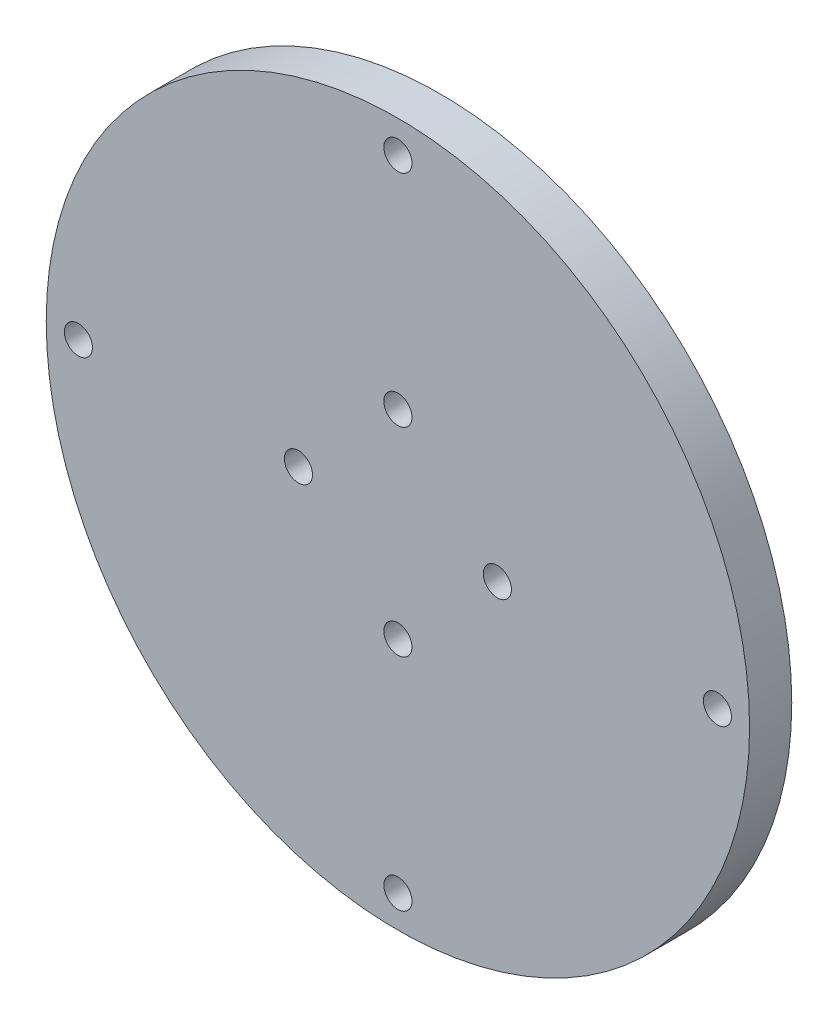
ISO-10303-21;
HEADER;
FILE_DESCRIPTION(('STEP AP214'),'2;1');
FILE_NAME('part.step','',(''),(''),'','','');
FILE_SCHEMA(('AUTOMOTIVE_DESIGN { 1 0 10303 214 1 1 1 1 }'));
ENDSEC;
DATA;
#1=APPLICATION_CONTEXT('core data for automotive mechanical design processes');
#2=APPLICATION_PROTOCOL_DEFINITION('international standard','automotive_design',2000,#1);
#3=PRODUCT_CONTEXT('',#1,'mechanical');
#4=PRODUCT('Part','Part','',(#3));
#5=PRODUCT_RELATED_PRODUCT_CATEGORY('part','',(#4));
#6=PRODUCT_DEFINITION_FORMATION('','',#4);
#7=PRODUCT_DEFINITION_CONTEXT('part definition',#1,'design');
#8=PRODUCT_DEFINITION('design','',#6,#7);
#9=PRODUCT_DEFINITION_SHAPE('','',#8);
#10=(LENGTH_UNIT() NAMED_UNIT(*) SI_UNIT(.MILLI.,.METRE.));
#11=(NAMED_UNIT(*) PLANE_ANGLE_UNIT() SI_UNIT($,.RADIAN.));
#12=(NAMED_UNIT(*) SI_UNIT($,.STERADIAN.) SOLID_ANGLE_UNIT());
#13=UNCERTAINTY_MEASURE_WITH_UNIT(LENGTH_MEASURE(1.E-05),#10,'distance_accuracy_value','');
#14=(GEOMETRIC_REPRESENTATION_CONTEXT(3) GLOBAL_UNCERTAINTY_ASSIGNED_CONTEXT((#13)) GLOBAL_UNIT_ASSIGNED_CONTEXT((#10,
#11,#12)) REPRESENTATION_CONTEXT('',''));
#15=CARTESIAN_POINT('',(0.,0.,0.));
#16=DIRECTION('',(0.,0.,1.));
#17=DIRECTION('',(1.,0.,0.));
#18=AXIS2_PLACEMENT_3D('',#15,#16,#17);
#19=CARTESIAN_POINT('',(0.,7.07106781186546,1.5));
#20=DIRECTION('',(0.,0.,-1.));
#21=DIRECTION('',(-1.,0.,0.));
#22=AXIS2_PLACEMENT_3D('',#19,#20,#21);
#23=CYLINDRICAL_SURFACE('',#22,1.);
#24=CARTESIAN_POINT('',(0.,7.07106781186546,1.5));
#25=DIRECTION('',(0.,0.,1.));
#26=DIRECTION('',(1.,0.,0.));
#27=AXIS2_PLACEMENT_3D('',#24,#25,#26);
#28=CIRCLE('',#27,1.);
#29=CARTESIAN_POINT('',(1.,7.07106781186546,1.5));
#30=VERTEX_POINT('',#29);
#31=EDGE_CURVE('E45',#30,#30,#28,.T.);
#32=ORIENTED_EDGE('',*,*,#31,.T.);
#33=EDGE_LOOP('',(#32));
#34=FACE_BOUND('',#33,.T.);
#35=CARTESIAN_POINT('',(0.,7.07106781186546,-1.5));
#36=DIRECTION('',(0.,0.,1.));
#37=DIRECTION('',(1.,0.,0.));
#38=AXIS2_PLACEMENT_3D('',#35,#36,#37);
#39=CIRCLE('',#38,1.);
#40=CARTESIAN_POINT('',(1.,7.07106781186546,-1.5));
#41=VERTEX_POINT('',#40);
#42=EDGE_CURVE('E74',#41,#41,#39,.T.);
#43=ORIENTED_EDGE('',*,*,#42,.F.);
#44=EDGE_LOOP('',(#43));
#45=FACE_BOUND('',#44,.T.);
#46=ADVANCED_FACE('F37',(#34,#45),#23,.F.);
#47=CARTESIAN_POINT('',(7.07106781186549,0.,1.5));
#48=DIRECTION('',(0.,0.,-1.));
#49=DIRECTION('',(-1.,0.,0.));
#50=AXIS2_PLACEMENT_3D('',#47,#48,#49);
#51=CYLINDRICAL_SURFACE('',#50,1.);
#52=CARTESIAN_POINT('',(7.07106781186549,0.,1.5));
#53=DIRECTION('',(0.,0.,1.));
#54=DIRECTION('',(1.,0.,0.));
#55=AXIS2_PLACEMENT_3D('',#52,#53,#54);
#56=CIRCLE('',#55,1.);
#57=CARTESIAN_POINT('',(8.07106781186549,0.,1.5));
#58=VERTEX_POINT('',#57);
#59=EDGE_CURVE('E50',#58,#58,#56,.T.);
#60=ORIENTED_EDGE('',*,*,#59,.T.);
#61=EDGE_LOOP('',(#60));
#62=FACE_BOUND('',#61,.T.);
#63=CARTESIAN_POINT('',(7.07106781186549,0.,-1.5));
#64=DIRECTION('',(0.,0.,1.));
#65=DIRECTION('',(1.,0.,0.));
#66=AXIS2_PLACEMENT_3D('',#63,#64,#65);
#67=CIRCLE('',#66,1.);
#68=CARTESIAN_POINT('',(8.07106781186549,0.,-1.5));
#69=VERTEX_POINT('',#68);
#70=EDGE_CURVE('E72',#69,#69,#67,.T.);
#71=ORIENTED_EDGE('',*,*,#70,.F.);
#72=EDGE_LOOP('',(#71));
#73=FACE_BOUND('',#72,.T.);
#74=ADVANCED_FACE('F104',(#62,#73),#51,.F.);
#75=CARTESIAN_POINT('',(0.,-7.07106781186547,1.5));
#76=DIRECTION('',(0.,0.,-1.));
#77=DIRECTION('',(-1.,0.,0.));
#78=AXIS2_PLACEMENT_3D('',#75,#76,#77);
#79=CYLINDRICAL_SURFACE('',#78,1.);
#80=CARTESIAN_POINT('',(0.,-7.07106781186547,1.5));
#81=DIRECTION('',(0.,0.,1.));
#82=DIRECTION('',(1.,0.,0.));
#83=AXIS2_PLACEMENT_3D('',#80,#81,#82);
#84=CIRCLE('',#83,1.);
#85=CARTESIAN_POINT('',(0.999999999999999,-7.07106781186547,1.5));
#86=VERTEX_POINT('',#85);
#87=EDGE_CURVE('E99',#86,#86,#84,.T.);
#88=ORIENTED_EDGE('',*,*,#87,.T.);
#89=EDGE_LOOP('',(#88));
#90=FACE_BOUND('',#89,.T.);
#91=CARTESIAN_POINT('',(0.,-7.07106781186547,-1.5));
#92=DIRECTION('',(0.,0.,1.));
#93=DIRECTION('',(1.,0.,0.));
#94=AXIS2_PLACEMENT_3D('',#91,#92,#93);
#95=CIRCLE('',#94,1.);
#96=CARTESIAN_POINT('',(0.999999999999999,-7.07106781186547,-1.5));
#97=VERTEX_POINT('',#96);
#98=EDGE_CURVE('E69',#97,#97,#95,.T.);
#99=ORIENTED_EDGE('',*,*,#98,.F.);
#100=EDGE_LOOP('',(#99));
#101=FACE_BOUND('',#100,.T.);
#102=ADVANCED_FACE('F122',(#90,#101),#79,.F.);
#103=CARTESIAN_POINT('',(-7.07106781186543,0.,1.5));
#104=DIRECTION('',(0.,0.,-1.));
#105=DIRECTION('',(-1.,0.,0.));
#106=AXIS2_PLACEMENT_3D('',#103,#104,#105);
#107=CYLINDRICAL_SURFACE('',#106,1.);
#108=CARTESIAN_POINT('',(-7.07106781186543,0.,1.5));
#109=DIRECTION('',(0.,0.,1.));
#110=DIRECTION('',(1.,0.,0.));
#111=AXIS2_PLACEMENT_3D('',#108,#109,#110);
#112=CIRCLE('',#111,1.);
#113=CARTESIAN_POINT('',(-6.07106781186543,0.,1.5));
#114=VERTEX_POINT('',#113);
#115=EDGE_CURVE('E96',#114,#114,#112,.T.);
#116=ORIENTED_EDGE('',*,*,#115,.T.);
#117=EDGE_LOOP('',(#116));
#118=FACE_BOUND('',#117,.T.);
#119=CARTESIAN_POINT('',(-7.07106781186543,0.,-1.5));
#120=DIRECTION('',(0.,0.,1.));
#121=DIRECTION('',(1.,0.,0.));
#122=AXIS2_PLACEMENT_3D('',#119,#120,#121);
#123=CIRCLE('',#122,1.);
#124=CARTESIAN_POINT('',(-6.07106781186543,0.,-1.5));
#125=VERTEX_POINT('',#124);
#126=EDGE_CURVE('E66',#125,#125,#123,.T.);
#127=ORIENTED_EDGE('',*,*,#126,.F.);
#128=EDGE_LOOP('',(#127));
#129=FACE_BOUND('',#128,.T.);
#130=ADVANCED_FACE('F129',(#118,#129),#107,.F.);
#131=CARTESIAN_POINT('',(-22.715,0.,1.5));
#132=DIRECTION('',(0.,0.,-1.));
#133=DIRECTION('',(-1.,0.,0.));
#134=AXIS2_PLACEMENT_3D('',#131,#132,#133);
#135=CYLINDRICAL_SURFACE('',#134,1.);
#136=CARTESIAN_POINT('',(-22.715,0.,1.5));
#137=DIRECTION('',(0.,0.,1.));
#138=DIRECTION('',(1.,0.,0.));
#139=AXIS2_PLACEMENT_3D('',#136,#137,#138);
#140=CIRCLE('',#139,1.);
#141=CARTESIAN_POINT('',(-21.715,0.,1.5));
#142=VERTEX_POINT('',#141);
#143=EDGE_CURVE('E93',#142,#142,#140,.T.);
#144=ORIENTED_EDGE('',*,*,#143,.T.);
#145=EDGE_LOOP('',(#144));
#146=FACE_BOUND('',#145,.T.);
#147=CARTESIAN_POINT('',(-22.715,0.,-1.5));
#148=DIRECTION('',(0.,0.,1.));
#149=DIRECTION('',(1.,0.,0.));
#150=AXIS2_PLACEMENT_3D('',#147,#148,#149);
#151=CIRCLE('',#150,1.);
#152=CARTESIAN_POINT('',(-21.715,0.,-1.5));
#153=VERTEX_POINT('',#152);
#154=EDGE_CURVE('E63',#153,#153,#151,.T.);
#155=ORIENTED_EDGE('',*,*,#154,.F.);
#156=EDGE_LOOP('',(#155));
#157=FACE_BOUND('',#156,.T.);
#158=ADVANCED_FACE('F133',(#146,#157),#135,.F.);
#159=CARTESIAN_POINT('',(0.,22.715,1.5));
#160=DIRECTION('',(0.,0.,-1.));
#161=DIRECTION('',(-1.,0.,0.));
#162=AXIS2_PLACEMENT_3D('',#159,#160,#161);
#163=CYLINDRICAL_SURFACE('',#162,1.);
#164=CARTESIAN_POINT('',(0.,22.715,1.5));
#165=DIRECTION('',(0.,0.,1.));
#166=DIRECTION('',(1.,0.,0.));
#167=AXIS2_PLACEMENT_3D('',#164,#165,#166);
#168=CIRCLE('',#167,1.);
#169=CARTESIAN_POINT('',(1.,22.715,1.5));
#170=VERTEX_POINT('',#169);
#171=EDGE_CURVE('E88',#170,#170,#168,.T.);
#172=ORIENTED_EDGE('',*,*,#171,.T.);
#173=EDGE_LOOP('',(#172));
#174=FACE_BOUND('',#173,.T.);
#175=CARTESIAN_POINT('',(0.,22.715,-1.5));
#176=DIRECTION('',(0.,0.,1.));
#177=DIRECTION('',(1.,0.,0.));
#178=AXIS2_PLACEMENT_3D('',#175,#176,#177);
#179=CIRCLE('',#178,1.);
#180=CARTESIAN_POINT('',(1.,22.715,-1.5));
#181=VERTEX_POINT('',#180);
#182=EDGE_CURVE('E60',#181,#181,#179,.T.);
#183=ORIENTED_EDGE('',*,*,#182,.F.);
#184=EDGE_LOOP('',(#183));
#185=FACE_BOUND('',#184,.T.);
#186=ADVANCED_FACE('F137',(#174,#185),#163,.F.);
#187=CARTESIAN_POINT('',(22.715,0.,1.5));
#188=DIRECTION('',(0.,0.,-1.));
#189=DIRECTION('',(-1.,0.,0.));
#190=AXIS2_PLACEMENT_3D('',#187,#188,#189);
#191=CYLINDRICAL_SURFACE('',#190,1.);
#192=CARTESIAN_POINT('',(22.715,0.,1.5));
#193=DIRECTION('',(0.,0.,1.));
#194=DIRECTION('',(1.,0.,0.));
#195=AXIS2_PLACEMENT_3D('',#192,#193,#194);
#196=CIRCLE('',#195,1.);
#197=CARTESIAN_POINT('',(23.715,0.,1.5));
#198=VERTEX_POINT('',#197);
#199=EDGE_CURVE('E83',#198,#198,#196,.T.);
#200=ORIENTED_EDGE('',*,*,#199,.T.);
#201=EDGE_LOOP('',(#200));
#202=FACE_BOUND('',#201,.T.);
#203=CARTESIAN_POINT('',(22.715,0.,-1.5));
#204=DIRECTION('',(0.,0.,1.));
#205=DIRECTION('',(1.,0.,0.));
#206=AXIS2_PLACEMENT_3D('',#203,#204,#205);
#207=CIRCLE('',#206,1.);
#208=CARTESIAN_POINT('',(23.715,0.,-1.5));
#209=VERTEX_POINT('',#208);
#210=EDGE_CURVE('E57',#209,#209,#207,.T.);
#211=ORIENTED_EDGE('',*,*,#210,.F.);
#212=EDGE_LOOP('',(#211));
#213=FACE_BOUND('',#212,.T.);
#214=ADVANCED_FACE('F140',(#202,#213),#191,.F.);
#215=CARTESIAN_POINT('',(0.,-22.715,1.5));
#216=DIRECTION('',(0.,0.,-1.));
#217=DIRECTION('',(-1.,0.,0.));
#218=AXIS2_PLACEMENT_3D('',#215,#216,#217);
#219=CYLINDRICAL_SURFACE('',#218,1.);
#220=CARTESIAN_POINT('',(0.,-22.715,1.5));
#221=DIRECTION('',(0.,0.,1.));
#222=DIRECTION('',(1.,0.,0.));
#223=AXIS2_PLACEMENT_3D('',#220,#221,#222);
#224=CIRCLE('',#223,1.);
#225=CARTESIAN_POINT('',(1.,-22.715,1.5));
#226=VERTEX_POINT('',#225);
#227=EDGE_CURVE('E79',#226,#226,#224,.T.);
#228=ORIENTED_EDGE('',*,*,#227,.T.);
#229=EDGE_LOOP('',(#228));
#230=FACE_BOUND('',#229,.T.);
#231=CARTESIAN_POINT('',(0.,-22.715,-1.5));
#232=DIRECTION('',(0.,0.,1.));
#233=DIRECTION('',(1.,0.,0.));
#234=AXIS2_PLACEMENT_3D('',#231,#232,#233);
#235=CIRCLE('',#234,1.);
#236=CARTESIAN_POINT('',(1.,-22.715,-1.5));
#237=VERTEX_POINT('',#236);
#238=EDGE_CURVE('E54',#237,#237,#235,.T.);
#239=ORIENTED_EDGE('',*,*,#238,.F.);
#240=EDGE_LOOP('',(#239));
#241=FACE_BOUND('',#240,.T.);
#242=ADVANCED_FACE('F39',(#230,#241),#219,.F.);
#243=CARTESIAN_POINT('',(0.,0.,1.5));
#244=DIRECTION('',(0.,0.,-1.));
#245=DIRECTION('',(-1.,0.,0.));
#246=AXIS2_PLACEMENT_3D('',#243,#244,#245);
#247=CYLINDRICAL_SURFACE('',#246,25.);
#248=CARTESIAN_POINT('',(0.,0.,1.5));
#249=DIRECTION('',(0.,0.,1.));
#250=DIRECTION('',(1.,0.,0.));
#251=AXIS2_PLACEMENT_3D('',#248,#249,#250);
#252=CIRCLE('',#251,25.);
#253=CARTESIAN_POINT('',(25.,0.,1.5));
#254=VERTEX_POINT('',#253);
#255=EDGE_CURVE('E10',#254,#254,#252,.T.);
#256=ORIENTED_EDGE('',*,*,#255,.F.);
#257=EDGE_LOOP('',(#256));
#258=FACE_BOUND('',#257,.T.);
#259=CARTESIAN_POINT('',(0.,0.,-1.5));
#260=DIRECTION('',(0.,0.,1.));
#261=DIRECTION('',(1.,0.,0.));
#262=AXIS2_PLACEMENT_3D('',#259,#260,#261);
#263=CIRCLE('',#262,25.);
#264=CARTESIAN_POINT('',(25.,0.,-1.5));
#265=VERTEX_POINT('',#264);
#266=EDGE_CURVE('E41',#265,#265,#263,.T.);
#267=ORIENTED_EDGE('',*,*,#266,.T.);
#268=EDGE_LOOP('',(#267));
#269=FACE_BOUND('',#268,.T.);
#270=ADVANCED_FACE('F111',(#258,#269),#247,.T.);
#271=CARTESIAN_POINT('',(0.,0.,1.5));
#272=DIRECTION('',(0.,0.,1.));
#273=DIRECTION('',(1.,0.,0.));
#274=AXIS2_PLACEMENT_3D('',#271,#272,#273);
#275=PLANE('',#274);
#276=ORIENTED_EDGE('',*,*,#227,.F.);
#277=EDGE_LOOP('',(#276));
#278=FACE_BOUND('',#277,.T.);
#279=ORIENTED_EDGE('',*,*,#199,.F.);
#280=EDGE_LOOP('',(#279));
#281=FACE_BOUND('',#280,.T.);
#282=ORIENTED_EDGE('',*,*,#171,.F.);
#283=EDGE_LOOP('',(#282));
#284=FACE_BOUND('',#283,.T.);
#285=ORIENTED_EDGE('',*,*,#143,.F.);
#286=EDGE_LOOP('',(#285));
#287=FACE_BOUND('',#286,.T.);
#288=ORIENTED_EDGE('',*,*,#115,.F.);
#289=EDGE_LOOP('',(#288));
#290=FACE_BOUND('',#289,.T.);
#291=ORIENTED_EDGE('',*,*,#87,.F.);
#292=EDGE_LOOP('',(#291));
#293=FACE_BOUND('',#292,.T.);
#294=ORIENTED_EDGE('',*,*,#59,.F.);
#295=EDGE_LOOP('',(#294));
#296=FACE_BOUND('',#295,.T.);
#297=ORIENTED_EDGE('',*,*,#31,.F.);
#298=EDGE_LOOP('',(#297));
#299=FACE_BOUND('',#298,.T.);
#300=ORIENTED_EDGE('',*,*,#255,.T.);
#301=EDGE_LOOP('',(#300));
#302=FACE_BOUND('',#301,.T.);
#303=ADVANCED_FACE('F107',(#278,#281,#284,#287,#290,#293,#296,#299,#302),#275,.T.);
#304=CARTESIAN_POINT('',(0.,0.,-1.5));
#305=DIRECTION('',(0.,0.,1.));
#306=DIRECTION('',(1.,0.,0.));
#307=AXIS2_PLACEMENT_3D('',#304,#305,#306);
#308=PLANE('',#307);
#309=ORIENTED_EDGE('',*,*,#238,.T.);
#310=EDGE_LOOP('',(#309));
#311=FACE_BOUND('',#310,.T.);
#312=ORIENTED_EDGE('',*,*,#210,.T.);
#313=EDGE_LOOP('',(#312));
#314=FACE_BOUND('',#313,.T.);
#315=ORIENTED_EDGE('',*,*,#182,.T.);
#316=EDGE_LOOP('',(#315));
#317=FACE_BOUND('',#316,.T.);
#318=ORIENTED_EDGE('',*,*,#154,.T.);
#319=EDGE_LOOP('',(#318));
#320=FACE_BOUND('',#319,.T.);
#321=ORIENTED_EDGE('',*,*,#126,.T.);
#322=EDGE_LOOP('',(#321));
#323=FACE_BOUND('',#322,.T.);
#324=ORIENTED_EDGE('',*,*,#98,.T.);
#325=EDGE_LOOP('',(#324));
#326=FACE_BOUND('',#325,.T.);
#327=ORIENTED_EDGE('',*,*,#70,.T.);
#328=EDGE_LOOP('',(#327));
#329=FACE_BOUND('',#328,.T.);
#330=ORIENTED_EDGE('',*,*,#42,.T.);
#331=EDGE_LOOP('',(#330));
#332=FACE_BOUND('',#331,.T.);
#333=ORIENTED_EDGE('',*,*,#266,.F.);
#334=EDGE_LOOP('',(#333));
#335=FACE_BOUND('',#334,.T.);
#336=ADVANCED_FACE('F110',(#311,#314,#317,#320,#323,#326,#329,#332,#335),#308,.F.);
#337=CLOSED_SHELL('',(#46,#74,#102,#130,#158,#186,#214,#242,#270,#303,#336));
#338=MANIFOLD_SOLID_BREP('B2',#337);
#339=ADVANCED_BREP_SHAPE_REPRESENTATION('',(#18,#338),#14);
#340=SHAPE_DEFINITION_REPRESENTATION(#9,#339);
ENDSEC;
END-ISO-10303-21;
